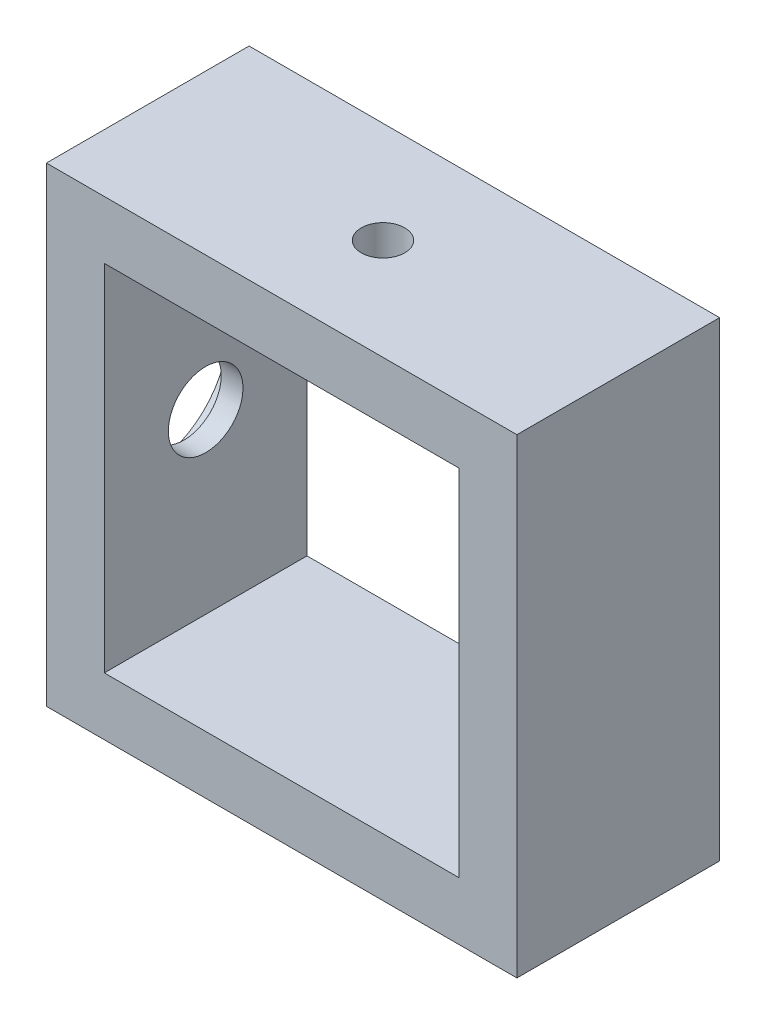
ISO-10303-21;
HEADER;
FILE_DESCRIPTION(('STEP AP214'),'2;1');
FILE_NAME('part.step','',(''),(''),'','','');
FILE_SCHEMA(('AUTOMOTIVE_DESIGN { 1 0 10303 214 1 1 1 1 }'));
ENDSEC;
DATA;
#1=APPLICATION_CONTEXT('core data for automotive mechanical design processes');
#2=APPLICATION_PROTOCOL_DEFINITION('international standard','automotive_design',2000,#1);
#3=PRODUCT_CONTEXT('',#1,'mechanical');
#4=PRODUCT('Part','Part','',(#3));
#5=PRODUCT_RELATED_PRODUCT_CATEGORY('part','',(#4));
#6=PRODUCT_DEFINITION_FORMATION('','',#4);
#7=PRODUCT_DEFINITION_CONTEXT('part definition',#1,'design');
#8=PRODUCT_DEFINITION('design','',#6,#7);
#9=PRODUCT_DEFINITION_SHAPE('','',#8);
#10=(LENGTH_UNIT() NAMED_UNIT(*) SI_UNIT(.MILLI.,.METRE.));
#11=(NAMED_UNIT(*) PLANE_ANGLE_UNIT() SI_UNIT($,.RADIAN.));
#12=(NAMED_UNIT(*) SI_UNIT($,.STERADIAN.) SOLID_ANGLE_UNIT());
#13=UNCERTAINTY_MEASURE_WITH_UNIT(LENGTH_MEASURE(1.E-05),#10,'distance_accuracy_value','');
#14=(GEOMETRIC_REPRESENTATION_CONTEXT(3) GLOBAL_UNCERTAINTY_ASSIGNED_CONTEXT((#13)) GLOBAL_UNIT_ASSIGNED_CONTEXT((#10,
#11,#12)) REPRESENTATION_CONTEXT('',''));
#15=CARTESIAN_POINT('',(0.,0.,0.));
#16=DIRECTION('',(0.,0.,1.));
#17=DIRECTION('',(1.,0.,0.));
#18=AXIS2_PLACEMENT_3D('',#15,#16,#17);
#19=CARTESIAN_POINT('',(0.,0.,28.));
#20=DIRECTION('',(0.,0.,-1.));
#21=DIRECTION('',(-1.,0.,0.));
#22=AXIS2_PLACEMENT_3D('',#19,#20,#21);
#23=PLANE('',#22);
#24=DIRECTION('',(0.,-1.,0.));
#25=VECTOR('',#24,1.);
#26=CARTESIAN_POINT('',(0.,0.,28.));
#27=LINE('',#26,#25);
#28=CARTESIAN_POINT('',(0.,65.,28.));
#29=VERTEX_POINT('',#28);
#30=CARTESIAN_POINT('',(0.,0.,28.));
#31=VERTEX_POINT('',#30);
#32=EDGE_CURVE('E137',#29,#31,#27,.T.);
#33=ORIENTED_EDGE('',*,*,#32,.T.);
#34=DIRECTION('',(1.,0.,0.));
#35=VECTOR('',#34,1.);
#36=CARTESIAN_POINT('',(0.,0.,28.));
#37=LINE('',#36,#35);
#38=CARTESIAN_POINT('',(65.,0.,28.));
#39=VERTEX_POINT('',#38);
#40=EDGE_CURVE('E140',#31,#39,#37,.T.);
#41=ORIENTED_EDGE('',*,*,#40,.T.);
#42=DIRECTION('',(0.,1.,0.));
#43=VECTOR('',#42,1.);
#44=CARTESIAN_POINT('',(65.,0.,28.));
#45=LINE('',#44,#43);
#46=CARTESIAN_POINT('',(65.,65.,28.));
#47=VERTEX_POINT('',#46);
#48=EDGE_CURVE('E143',#39,#47,#45,.T.);
#49=ORIENTED_EDGE('',*,*,#48,.T.);
#50=DIRECTION('',(-1.,0.,0.));
#51=VECTOR('',#50,1.);
#52=CARTESIAN_POINT('',(0.,65.,28.));
#53=LINE('',#52,#51);
#54=EDGE_CURVE('E145',#47,#29,#53,.T.);
#55=ORIENTED_EDGE('',*,*,#54,.T.);
#56=EDGE_LOOP('',(#33,#41,#49,#55));
#57=FACE_BOUND('',#56,.T.);
#58=DIRECTION('',(1.,0.,0.));
#59=VECTOR('',#58,1.);
#60=CARTESIAN_POINT('',(8.,8.,28.));
#61=LINE('',#60,#59);
#62=CARTESIAN_POINT('',(8.,8.,28.));
#63=VERTEX_POINT('',#62);
#64=CARTESIAN_POINT('',(57.,8.,28.));
#65=VERTEX_POINT('',#64);
#66=EDGE_CURVE('E99',#63,#65,#61,.T.);
#67=ORIENTED_EDGE('',*,*,#66,.F.);
#68=DIRECTION('',(0.,-1.,0.));
#69=VECTOR('',#68,1.);
#70=CARTESIAN_POINT('',(8.,8.,28.));
#71=LINE('',#70,#69);
#72=CARTESIAN_POINT('',(8.,57.,28.));
#73=VERTEX_POINT('',#72);
#74=EDGE_CURVE('E121',#73,#63,#71,.T.);
#75=ORIENTED_EDGE('',*,*,#74,.F.);
#76=DIRECTION('',(-1.,0.,0.));
#77=VECTOR('',#76,1.);
#78=CARTESIAN_POINT('',(8.,57.,28.));
#79=LINE('',#78,#77);
#80=CARTESIAN_POINT('',(57.,57.,28.));
#81=VERTEX_POINT('',#80);
#82=EDGE_CURVE('E119',#81,#73,#79,.T.);
#83=ORIENTED_EDGE('',*,*,#82,.F.);
#84=DIRECTION('',(0.,1.,0.));
#85=VECTOR('',#84,1.);
#86=CARTESIAN_POINT('',(57.,8.,28.));
#87=LINE('',#86,#85);
#88=EDGE_CURVE('E107',#65,#81,#87,.T.);
#89=ORIENTED_EDGE('',*,*,#88,.F.);
#90=EDGE_LOOP('',(#67,#75,#83,#89));
#91=FACE_BOUND('',#90,.T.);
#92=ADVANCED_FACE('F33',(#57,#91),#23,.F.);
#93=CARTESIAN_POINT('',(0.,0.,0.));
#94=DIRECTION('',(0.,0.,-1.));
#95=DIRECTION('',(-1.,0.,0.));
#96=AXIS2_PLACEMENT_3D('',#93,#94,#95);
#97=PLANE('',#96);
#98=DIRECTION('',(0.,-1.,0.));
#99=VECTOR('',#98,1.);
#100=CARTESIAN_POINT('',(0.,0.,0.));
#101=LINE('',#100,#99);
#102=CARTESIAN_POINT('',(0.,65.,0.));
#103=VERTEX_POINT('',#102);
#104=CARTESIAN_POINT('',(0.,0.,0.));
#105=VERTEX_POINT('',#104);
#106=EDGE_CURVE('E115',#103,#105,#101,.T.);
#107=ORIENTED_EDGE('',*,*,#106,.F.);
#108=DIRECTION('',(-1.,0.,0.));
#109=VECTOR('',#108,1.);
#110=CARTESIAN_POINT('',(0.,65.,0.));
#111=LINE('',#110,#109);
#112=CARTESIAN_POINT('',(65.,65.,0.));
#113=VERTEX_POINT('',#112);
#114=EDGE_CURVE('E141',#113,#103,#111,.T.);
#115=ORIENTED_EDGE('',*,*,#114,.F.);
#116=DIRECTION('',(0.,1.,0.));
#117=VECTOR('',#116,1.);
#118=CARTESIAN_POINT('',(65.,0.,0.));
#119=LINE('',#118,#117);
#120=CARTESIAN_POINT('',(65.,0.,0.));
#121=VERTEX_POINT('',#120);
#122=EDGE_CURVE('E152',#121,#113,#119,.T.);
#123=ORIENTED_EDGE('',*,*,#122,.F.);
#124=DIRECTION('',(1.,0.,0.));
#125=VECTOR('',#124,1.);
#126=CARTESIAN_POINT('',(0.,0.,0.));
#127=LINE('',#126,#125);
#128=EDGE_CURVE('E150',#105,#121,#127,.T.);
#129=ORIENTED_EDGE('',*,*,#128,.F.);
#130=EDGE_LOOP('',(#107,#115,#123,#129));
#131=FACE_BOUND('',#130,.T.);
#132=DIRECTION('',(0.,-1.,0.));
#133=VECTOR('',#132,1.);
#134=CARTESIAN_POINT('',(8.,8.,0.));
#135=LINE('',#134,#133);
#136=CARTESIAN_POINT('',(8.,57.,0.));
#137=VERTEX_POINT('',#136);
#138=CARTESIAN_POINT('',(8.,8.,0.));
#139=VERTEX_POINT('',#138);
#140=EDGE_CURVE('E108',#137,#139,#135,.T.);
#141=ORIENTED_EDGE('',*,*,#140,.T.);
#142=DIRECTION('',(1.,0.,0.));
#143=VECTOR('',#142,1.);
#144=CARTESIAN_POINT('',(8.,8.,0.));
#145=LINE('',#144,#143);
#146=CARTESIAN_POINT('',(57.,8.,0.));
#147=VERTEX_POINT('',#146);
#148=EDGE_CURVE('E57',#139,#147,#145,.T.);
#149=ORIENTED_EDGE('',*,*,#148,.T.);
#150=DIRECTION('',(0.,1.,0.));
#151=VECTOR('',#150,1.);
#152=CARTESIAN_POINT('',(57.,8.,0.));
#153=LINE('',#152,#151);
#154=CARTESIAN_POINT('',(57.,57.,0.));
#155=VERTEX_POINT('',#154);
#156=EDGE_CURVE('E114',#147,#155,#153,.T.);
#157=ORIENTED_EDGE('',*,*,#156,.T.);
#158=DIRECTION('',(-1.,0.,0.));
#159=VECTOR('',#158,1.);
#160=CARTESIAN_POINT('',(8.,57.,0.));
#161=LINE('',#160,#159);
#162=EDGE_CURVE('E129',#155,#137,#161,.T.);
#163=ORIENTED_EDGE('',*,*,#162,.T.);
#164=EDGE_LOOP('',(#141,#149,#157,#163));
#165=FACE_BOUND('',#164,.T.);
#166=ADVANCED_FACE('F171',(#131,#165),#97,.T.);
#167=CARTESIAN_POINT('',(0.,0.,28.));
#168=DIRECTION('',(1.,0.,0.));
#169=DIRECTION('',(0.,0.,-1.));
#170=AXIS2_PLACEMENT_3D('',#167,#168,#169);
#171=PLANE('',#170);
#172=CARTESIAN_POINT('',(0.,32.5,14.));
#173=DIRECTION('',(-1.,0.,0.));
#174=DIRECTION('',(0.,0.,1.));
#175=AXIS2_PLACEMENT_3D('',#172,#173,#174);
#176=CIRCLE('',#175,11.115);
#177=CARTESIAN_POINT('',(0.,32.5,25.115));
#178=VERTEX_POINT('',#177);
#179=EDGE_CURVE('E233',#178,#178,#176,.T.);
#180=ORIENTED_EDGE('',*,*,#179,.F.);
#181=EDGE_LOOP('',(#180));
#182=FACE_BOUND('',#181,.T.);
#183=ORIENTED_EDGE('',*,*,#106,.T.);
#184=DIRECTION('',(0.,0.,-1.));
#185=VECTOR('',#184,1.);
#186=CARTESIAN_POINT('',(0.,0.,28.));
#187=LINE('',#186,#185);
#188=EDGE_CURVE('E11',#31,#105,#187,.T.);
#189=ORIENTED_EDGE('',*,*,#188,.F.);
#190=ORIENTED_EDGE('',*,*,#32,.F.);
#191=DIRECTION('',(0.,0.,-1.));
#192=VECTOR('',#191,1.);
#193=CARTESIAN_POINT('',(0.,65.,28.));
#194=LINE('',#193,#192);
#195=EDGE_CURVE('E147',#29,#103,#194,.T.);
#196=ORIENTED_EDGE('',*,*,#195,.T.);
#197=EDGE_LOOP('',(#183,#189,#190,#196));
#198=FACE_BOUND('',#197,.T.);
#199=ADVANCED_FACE('F35',(#182,#198),#171,.F.);
#200=CARTESIAN_POINT('',(0.,0.,28.));
#201=DIRECTION('',(0.,1.,0.));
#202=DIRECTION('',(0.,0.,1.));
#203=AXIS2_PLACEMENT_3D('',#200,#201,#202);
#204=PLANE('',#203);
#205=CARTESIAN_POINT('',(32.5,0.,14.));
#206=DIRECTION('',(0.,-1.,0.));
#207=DIRECTION('',(0.,0.,-1.));
#208=AXIS2_PLACEMENT_3D('',#205,#206,#207);
#209=CIRCLE('',#208,3.175);
#210=CARTESIAN_POINT('',(32.5,0.,10.825));
#211=VERTEX_POINT('',#210);
#212=EDGE_CURVE('E220',#211,#211,#209,.T.);
#213=ORIENTED_EDGE('',*,*,#212,.F.);
#214=EDGE_LOOP('',(#213));
#215=FACE_BOUND('',#214,.T.);
#216=ORIENTED_EDGE('',*,*,#128,.T.);
#217=DIRECTION('',(0.,0.,-1.));
#218=VECTOR('',#217,1.);
#219=CARTESIAN_POINT('',(65.,0.,28.));
#220=LINE('',#219,#218);
#221=EDGE_CURVE('E42',#39,#121,#220,.T.);
#222=ORIENTED_EDGE('',*,*,#221,.F.);
#223=ORIENTED_EDGE('',*,*,#40,.F.);
#224=ORIENTED_EDGE('',*,*,#188,.T.);
#225=EDGE_LOOP('',(#216,#222,#223,#224));
#226=FACE_BOUND('',#225,.T.);
#227=ADVANCED_FACE('F181',(#215,#226),#204,.F.);
#228=CARTESIAN_POINT('',(65.,0.,28.));
#229=DIRECTION('',(-1.,0.,0.));
#230=DIRECTION('',(0.,0.,1.));
#231=AXIS2_PLACEMENT_3D('',#228,#229,#230);
#232=PLANE('',#231);
#233=ORIENTED_EDGE('',*,*,#122,.T.);
#234=DIRECTION('',(0.,0.,-1.));
#235=VECTOR('',#234,1.);
#236=CARTESIAN_POINT('',(65.,65.,28.));
#237=LINE('',#236,#235);
#238=EDGE_CURVE('E157',#47,#113,#237,.T.);
#239=ORIENTED_EDGE('',*,*,#238,.F.);
#240=ORIENTED_EDGE('',*,*,#48,.F.);
#241=ORIENTED_EDGE('',*,*,#221,.T.);
#242=EDGE_LOOP('',(#233,#239,#240,#241));
#243=FACE_BOUND('',#242,.T.);
#244=ADVANCED_FACE('F165',(#243),#232,.F.);
#245=CARTESIAN_POINT('',(0.,65.,28.));
#246=DIRECTION('',(0.,-1.,0.));
#247=DIRECTION('',(0.,0.,-1.));
#248=AXIS2_PLACEMENT_3D('',#245,#246,#247);
#249=PLANE('',#248);
#250=CARTESIAN_POINT('',(32.5,65.,14.));
#251=DIRECTION('',(0.,1.,0.));
#252=DIRECTION('',(0.,0.,1.));
#253=AXIS2_PLACEMENT_3D('',#250,#251,#252);
#254=CIRCLE('',#253,3.);
#255=CARTESIAN_POINT('',(32.5,65.,17.));
#256=VERTEX_POINT('',#255);
#257=EDGE_CURVE('E211',#256,#256,#254,.T.);
#258=ORIENTED_EDGE('',*,*,#257,.F.);
#259=EDGE_LOOP('',(#258));
#260=FACE_BOUND('',#259,.T.);
#261=ORIENTED_EDGE('',*,*,#114,.T.);
#262=ORIENTED_EDGE('',*,*,#195,.F.);
#263=ORIENTED_EDGE('',*,*,#54,.F.);
#264=ORIENTED_EDGE('',*,*,#238,.T.);
#265=EDGE_LOOP('',(#261,#262,#263,#264));
#266=FACE_BOUND('',#265,.T.);
#267=ADVANCED_FACE('F175',(#260,#266),#249,.F.);
#268=CARTESIAN_POINT('',(8.,8.,28.));
#269=DIRECTION('',(0.,1.,0.));
#270=DIRECTION('',(0.,0.,1.));
#271=AXIS2_PLACEMENT_3D('',#268,#269,#270);
#272=PLANE('',#271);
#273=ORIENTED_EDGE('',*,*,#148,.F.);
#274=DIRECTION('',(0.,0.,-1.));
#275=VECTOR('',#274,1.);
#276=CARTESIAN_POINT('',(8.,8.,28.));
#277=LINE('',#276,#275);
#278=EDGE_CURVE('E103',#63,#139,#277,.T.);
#279=ORIENTED_EDGE('',*,*,#278,.F.);
#280=ORIENTED_EDGE('',*,*,#66,.T.);
#281=DIRECTION('',(0.,0.,-1.));
#282=VECTOR('',#281,1.);
#283=CARTESIAN_POINT('',(57.,8.,28.));
#284=LINE('',#283,#282);
#285=EDGE_CURVE('E102',#65,#147,#284,.T.);
#286=ORIENTED_EDGE('',*,*,#285,.T.);
#287=EDGE_LOOP('',(#273,#279,#280,#286));
#288=FACE_BOUND('',#287,.T.);
#289=ADVANCED_FACE('F101',(#288),#272,.T.);
#290=CARTESIAN_POINT('',(57.,8.,28.));
#291=DIRECTION('',(-1.,0.,0.));
#292=DIRECTION('',(0.,0.,1.));
#293=AXIS2_PLACEMENT_3D('',#290,#291,#292);
#294=PLANE('',#293);
#295=CARTESIAN_POINT('',(57.,32.5,14.));
#296=DIRECTION('',(-1.,0.,0.));
#297=DIRECTION('',(0.,0.,1.));
#298=AXIS2_PLACEMENT_3D('',#295,#296,#297);
#299=CIRCLE('',#298,6.5);
#300=CARTESIAN_POINT('',(57.,32.5,20.5));
#301=VERTEX_POINT('',#300);
#302=EDGE_CURVE('E217',#301,#301,#299,.T.);
#303=ORIENTED_EDGE('',*,*,#302,.F.);
#304=EDGE_LOOP('',(#303));
#305=FACE_BOUND('',#304,.T.);
#306=ORIENTED_EDGE('',*,*,#156,.F.);
#307=ORIENTED_EDGE('',*,*,#285,.F.);
#308=ORIENTED_EDGE('',*,*,#88,.T.);
#309=DIRECTION('',(0.,0.,-1.));
#310=VECTOR('',#309,1.);
#311=CARTESIAN_POINT('',(57.,57.,28.));
#312=LINE('',#311,#310);
#313=EDGE_CURVE('E116',#81,#155,#312,.T.);
#314=ORIENTED_EDGE('',*,*,#313,.T.);
#315=EDGE_LOOP('',(#306,#307,#308,#314));
#316=FACE_BOUND('',#315,.T.);
#317=ADVANCED_FACE('F111',(#305,#316),#294,.T.);
#318=CARTESIAN_POINT('',(8.,57.,28.));
#319=DIRECTION('',(0.,-1.,0.));
#320=DIRECTION('',(0.,0.,-1.));
#321=AXIS2_PLACEMENT_3D('',#318,#319,#320);
#322=PLANE('',#321);
#323=ORIENTED_EDGE('',*,*,#162,.F.);
#324=ORIENTED_EDGE('',*,*,#313,.F.);
#325=ORIENTED_EDGE('',*,*,#82,.T.);
#326=DIRECTION('',(0.,0.,-1.));
#327=VECTOR('',#326,1.);
#328=CARTESIAN_POINT('',(8.,57.,28.));
#329=LINE('',#328,#327);
#330=EDGE_CURVE('E49',#73,#137,#329,.T.);
#331=ORIENTED_EDGE('',*,*,#330,.T.);
#332=EDGE_LOOP('',(#323,#324,#325,#331));
#333=FACE_BOUND('',#332,.T.);
#334=ADVANCED_FACE('F256',(#333),#322,.T.);
#335=CARTESIAN_POINT('',(8.,8.,28.));
#336=DIRECTION('',(1.,0.,0.));
#337=DIRECTION('',(0.,0.,-1.));
#338=AXIS2_PLACEMENT_3D('',#335,#336,#337);
#339=PLANE('',#338);
#340=CARTESIAN_POINT('',(8.,32.5,14.));
#341=DIRECTION('',(-1.,0.,0.));
#342=DIRECTION('',(0.,0.,1.));
#343=AXIS2_PLACEMENT_3D('',#340,#341,#342);
#344=CIRCLE('',#343,5.155);
#345=CARTESIAN_POINT('',(8.,32.5,19.155));
#346=VERTEX_POINT('',#345);
#347=EDGE_CURVE('E227',#346,#346,#344,.T.);
#348=ORIENTED_EDGE('',*,*,#347,.T.);
#349=EDGE_LOOP('',(#348));
#350=FACE_BOUND('',#349,.T.);
#351=ORIENTED_EDGE('',*,*,#140,.F.);
#352=ORIENTED_EDGE('',*,*,#330,.F.);
#353=ORIENTED_EDGE('',*,*,#74,.T.);
#354=ORIENTED_EDGE('',*,*,#278,.T.);
#355=EDGE_LOOP('',(#351,#352,#353,#354));
#356=FACE_BOUND('',#355,.T.);
#357=ADVANCED_FACE('F251',(#350,#356),#339,.T.);
#358=CARTESIAN_POINT('',(5.,32.5,14.));
#359=DIRECTION('',(-1.,0.,0.));
#360=DIRECTION('',(0.,0.,1.));
#361=AXIS2_PLACEMENT_3D('',#358,#359,#360);
#362=CYLINDRICAL_SURFACE('',#361,11.115);
#363=CARTESIAN_POINT('',(5.,32.5,14.));
#364=DIRECTION('',(-1.,0.,0.));
#365=DIRECTION('',(0.,0.,1.));
#366=AXIS2_PLACEMENT_3D('',#363,#364,#365);
#367=CIRCLE('',#366,11.115);
#368=CARTESIAN_POINT('',(5.,32.5,25.115));
#369=VERTEX_POINT('',#368);
#370=EDGE_CURVE('E127',#369,#369,#367,.T.);
#371=ORIENTED_EDGE('',*,*,#370,.F.);
#372=EDGE_LOOP('',(#371));
#373=FACE_BOUND('',#372,.T.);
#374=ORIENTED_EDGE('',*,*,#179,.T.);
#375=EDGE_LOOP('',(#374));
#376=FACE_BOUND('',#375,.T.);
#377=ADVANCED_FACE('F246',(#373,#376),#362,.F.);
#378=CARTESIAN_POINT('',(5.,32.5,14.));
#379=DIRECTION('',(-1.,0.,0.));
#380=DIRECTION('',(0.,0.,1.));
#381=AXIS2_PLACEMENT_3D('',#378,#379,#380);
#382=PLANE('',#381);
#383=CARTESIAN_POINT('',(5.,32.5,14.));
#384=DIRECTION('',(-1.,0.,0.));
#385=DIRECTION('',(0.,0.,1.));
#386=AXIS2_PLACEMENT_3D('',#383,#384,#385);
#387=CIRCLE('',#386,5.155);
#388=CARTESIAN_POINT('',(5.,32.5,19.155));
#389=VERTEX_POINT('',#388);
#390=EDGE_CURVE('E37',#389,#389,#387,.T.);
#391=ORIENTED_EDGE('',*,*,#390,.F.);
#392=EDGE_LOOP('',(#391));
#393=FACE_BOUND('',#392,.T.);
#394=ORIENTED_EDGE('',*,*,#370,.T.);
#395=EDGE_LOOP('',(#394));
#396=FACE_BOUND('',#395,.T.);
#397=ADVANCED_FACE('F243',(#393,#396),#382,.T.);
#398=CARTESIAN_POINT('',(8.,32.5,14.));
#399=DIRECTION('',(-1.,0.,0.));
#400=DIRECTION('',(0.,0.,1.));
#401=AXIS2_PLACEMENT_3D('',#398,#399,#400);
#402=CYLINDRICAL_SURFACE('',#401,5.155);
#403=ORIENTED_EDGE('',*,*,#390,.T.);
#404=EDGE_LOOP('',(#403));
#405=FACE_BOUND('',#404,.T.);
#406=ORIENTED_EDGE('',*,*,#347,.F.);
#407=EDGE_LOOP('',(#406));
#408=FACE_BOUND('',#407,.T.);
#409=ADVANCED_FACE('F240',(#405,#408),#402,.F.);
#410=CARTESIAN_POINT('',(62.,32.5,14.));
#411=DIRECTION('',(-1.,0.,0.));
#412=DIRECTION('',(0.,0.,1.));
#413=AXIS2_PLACEMENT_3D('',#410,#411,#412);
#414=CYLINDRICAL_SURFACE('',#413,6.5);
#415=CARTESIAN_POINT('',(62.,32.5,14.));
#416=DIRECTION('',(-1.,0.,0.));
#417=DIRECTION('',(0.,0.,1.));
#418=AXIS2_PLACEMENT_3D('',#415,#416,#417);
#419=CIRCLE('',#418,6.5);
#420=CARTESIAN_POINT('',(62.,32.5,20.5));
#421=VERTEX_POINT('',#420);
#422=EDGE_CURVE('E224',#421,#421,#419,.T.);
#423=ORIENTED_EDGE('',*,*,#422,.F.);
#424=EDGE_LOOP('',(#423));
#425=FACE_BOUND('',#424,.T.);
#426=ORIENTED_EDGE('',*,*,#302,.T.);
#427=EDGE_LOOP('',(#426));
#428=FACE_BOUND('',#427,.T.);
#429=ADVANCED_FACE('F269',(#425,#428),#414,.F.);
#430=CARTESIAN_POINT('',(62.,32.5,14.));
#431=DIRECTION('',(-1.,0.,0.));
#432=DIRECTION('',(0.,0.,1.));
#433=AXIS2_PLACEMENT_3D('',#430,#431,#432);
#434=PLANE('',#433);
#435=ORIENTED_EDGE('',*,*,#422,.T.);
#436=EDGE_LOOP('',(#435));
#437=FACE_BOUND('',#436,.T.);
#438=ADVANCED_FACE('F271',(#437),#434,.T.);
#439=CARTESIAN_POINT('',(32.5,60.,14.));
#440=DIRECTION('',(0.,1.,0.));
#441=DIRECTION('',(0.,0.,1.));
#442=AXIS2_PLACEMENT_3D('',#439,#440,#441);
#443=CYLINDRICAL_SURFACE('',#442,3.);
#444=CARTESIAN_POINT('',(32.5,60.,14.));
#445=DIRECTION('',(0.,1.,0.));
#446=DIRECTION('',(0.,0.,1.));
#447=AXIS2_PLACEMENT_3D('',#444,#445,#446);
#448=CIRCLE('',#447,3.);
#449=CARTESIAN_POINT('',(32.5,60.,17.));
#450=VERTEX_POINT('',#449);
#451=EDGE_CURVE('E213',#450,#450,#448,.T.);
#452=ORIENTED_EDGE('',*,*,#451,.F.);
#453=EDGE_LOOP('',(#452));
#454=FACE_BOUND('',#453,.T.);
#455=ORIENTED_EDGE('',*,*,#257,.T.);
#456=EDGE_LOOP('',(#455));
#457=FACE_BOUND('',#456,.T.);
#458=ADVANCED_FACE('F278',(#454,#457),#443,.F.);
#459=CARTESIAN_POINT('',(32.5,60.,14.));
#460=DIRECTION('',(0.,1.,0.));
#461=DIRECTION('',(0.,0.,1.));
#462=AXIS2_PLACEMENT_3D('',#459,#460,#461);
#463=PLANE('',#462);
#464=ORIENTED_EDGE('',*,*,#451,.T.);
#465=EDGE_LOOP('',(#464));
#466=FACE_BOUND('',#465,.T.);
#467=ADVANCED_FACE('F285',(#466),#463,.T.);
#468=CARTESIAN_POINT('',(32.5,5.,14.));
#469=DIRECTION('',(0.,-1.,0.));
#470=DIRECTION('',(0.,0.,-1.));
#471=AXIS2_PLACEMENT_3D('',#468,#469,#470);
#472=CYLINDRICAL_SURFACE('',#471,3.175);
#473=CARTESIAN_POINT('',(32.5,5.,14.));
#474=DIRECTION('',(0.,-1.,0.));
#475=DIRECTION('',(0.,0.,-1.));
#476=AXIS2_PLACEMENT_3D('',#473,#474,#475);
#477=CIRCLE('',#476,3.175);
#478=CARTESIAN_POINT('',(32.5,5.,10.825));
#479=VERTEX_POINT('',#478);
#480=EDGE_CURVE('E214',#479,#479,#477,.T.);
#481=ORIENTED_EDGE('',*,*,#480,.F.);
#482=EDGE_LOOP('',(#481));
#483=FACE_BOUND('',#482,.T.);
#484=ORIENTED_EDGE('',*,*,#212,.T.);
#485=EDGE_LOOP('',(#484));
#486=FACE_BOUND('',#485,.T.);
#487=ADVANCED_FACE('F289',(#483,#486),#472,.F.);
#488=CARTESIAN_POINT('',(32.5,5.,14.));
#489=DIRECTION('',(0.,-1.,0.));
#490=DIRECTION('',(0.,0.,-1.));
#491=AXIS2_PLACEMENT_3D('',#488,#489,#490);
#492=PLANE('',#491);
#493=ORIENTED_EDGE('',*,*,#480,.T.);
#494=EDGE_LOOP('',(#493));
#495=FACE_BOUND('',#494,.T.);
#496=ADVANCED_FACE('F293',(#495),#492,.T.);
#497=CLOSED_SHELL('',(#92,#166,#199,#227,#244,#267,#289,#317,#334,#357,#377,#397,#409,#429,#438,
#458,#467,#487,#496));
#498=MANIFOLD_SOLID_BREP('B2',#497);
#499=ADVANCED_BREP_SHAPE_REPRESENTATION('',(#18,#498),#14);
#500=SHAPE_DEFINITION_REPRESENTATION(#9,#499);
ENDSEC;
END-ISO-10303-21;
